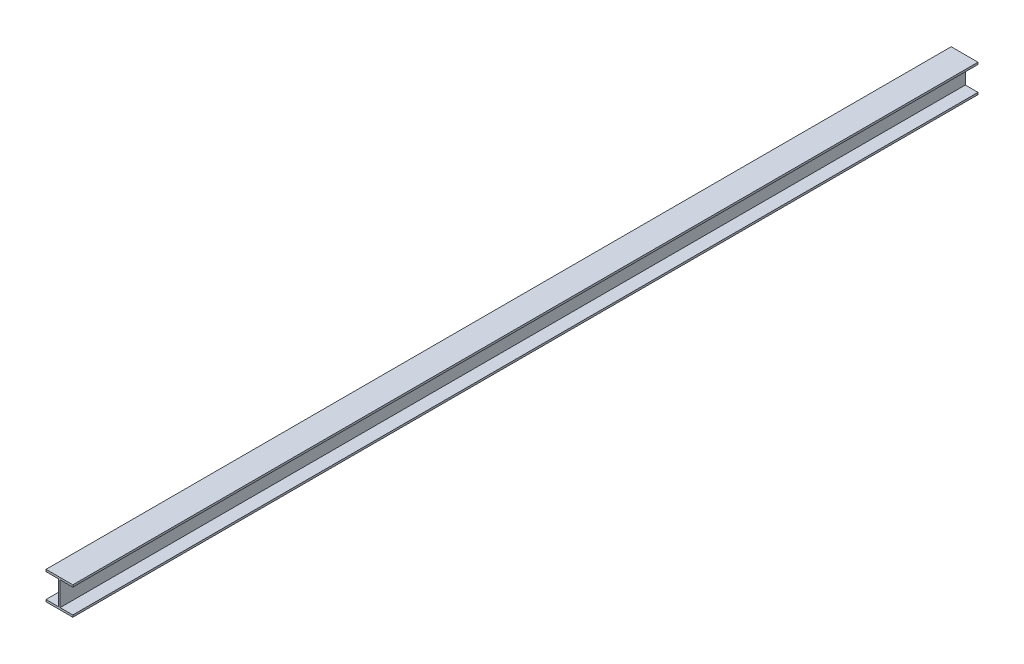
ISO-10303-21;
HEADER;
FILE_DESCRIPTION(('STEP AP214'),'2;1');
FILE_NAME('part.step','',(''),(''),'','','');
FILE_SCHEMA(('AUTOMOTIVE_DESIGN { 1 0 10303 214 1 1 1 1 }'));
ENDSEC;
DATA;
#1=APPLICATION_CONTEXT('core data for automotive mechanical design processes');
#2=APPLICATION_PROTOCOL_DEFINITION('international standard','automotive_design',2000,#1);
#3=PRODUCT_CONTEXT('',#1,'mechanical');
#4=PRODUCT('Part','Part','',(#3));
#5=PRODUCT_RELATED_PRODUCT_CATEGORY('part','',(#4));
#6=PRODUCT_DEFINITION_FORMATION('','',#4);
#7=PRODUCT_DEFINITION_CONTEXT('part definition',#1,'design');
#8=PRODUCT_DEFINITION('design','',#6,#7);
#9=PRODUCT_DEFINITION_SHAPE('','',#8);
#10=(LENGTH_UNIT() NAMED_UNIT(*) SI_UNIT(.MILLI.,.METRE.));
#11=(NAMED_UNIT(*) PLANE_ANGLE_UNIT() SI_UNIT($,.RADIAN.));
#12=(NAMED_UNIT(*) SI_UNIT($,.STERADIAN.) SOLID_ANGLE_UNIT());
#13=UNCERTAINTY_MEASURE_WITH_UNIT(LENGTH_MEASURE(1.E-05),#10,'distance_accuracy_value','');
#14=(GEOMETRIC_REPRESENTATION_CONTEXT(3) GLOBAL_UNCERTAINTY_ASSIGNED_CONTEXT((#13)) GLOBAL_UNIT_ASSIGNED_CONTEXT((#10,
#11,#12)) REPRESENTATION_CONTEXT('',''));
#15=CARTESIAN_POINT('',(0.,0.,0.));
#16=DIRECTION('',(0.,0.,1.));
#17=DIRECTION('',(1.,0.,0.));
#18=AXIS2_PLACEMENT_3D('',#15,#16,#17);
#19=CARTESIAN_POINT('',(154.432,-162.052240532958,5214.4));
#20=DIRECTION('',(0.,1.,0.));
#21=DIRECTION('',(-1.,0.,0.));
#22=AXIS2_PLACEMENT_3D('',#19,#20,#21);
#23=PLANE('',#22);
#24=DIRECTION('',(1.,0.,0.));
#25=VECTOR('',#24,1.);
#26=CARTESIAN_POINT('',(154.432,-162.052240532958,598.019975105255));
#27=LINE('',#26,#25);
#28=CARTESIAN_POINT('',(0.,-162.052240532958,598.019975105257));
#29=VERTEX_POINT('',#28);
#30=CARTESIAN_POINT('',(154.432,-162.052240532958,598.019975105257));
#31=VERTEX_POINT('',#30);
#32=EDGE_CURVE('E11',#29,#31,#27,.T.);
#33=ORIENTED_EDGE('',*,*,#32,.F.);
#34=DIRECTION('',(0.,0.,-1.));
#35=VECTOR('',#34,1.);
#36=CARTESIAN_POINT('',(0.,-162.052240532958,5214.4));
#37=LINE('',#36,#35);
#38=CARTESIAN_POINT('',(0.,-162.052240532958,0.));
#39=VERTEX_POINT('',#38);
#40=EDGE_CURVE('E222',#29,#39,#37,.T.);
#41=ORIENTED_EDGE('',*,*,#40,.T.);
#42=DIRECTION('',(1.,0.,0.));
#43=VECTOR('',#42,1.);
#44=CARTESIAN_POINT('',(154.432,-162.052240532958,0.));
#45=LINE('',#44,#43);
#46=CARTESIAN_POINT('',(154.432,-162.052240532958,0.));
#47=VERTEX_POINT('',#46);
#48=EDGE_CURVE('E292',#39,#47,#45,.T.);
#49=ORIENTED_EDGE('',*,*,#48,.T.);
#50=DIRECTION('',(0.,0.,-1.));
#51=VECTOR('',#50,1.);
#52=CARTESIAN_POINT('',(154.432,-162.052240532958,5214.4));
#53=LINE('',#52,#51);
#54=EDGE_CURVE('E255',#31,#47,#53,.T.);
#55=ORIENTED_EDGE('',*,*,#54,.F.);
#56=EDGE_LOOP('',(#33,#41,#49,#55));
#57=FACE_BOUND('',#56,.T.);
#58=ADVANCED_FACE('F37',(#57),#23,.F.);
#59=DIRECTION('',(-1.,0.,0.));
#60=VECTOR('',#59,1.);
#61=CARTESIAN_POINT('',(154.432,-162.052240532958,902.819975105255));
#62=LINE('',#61,#60);
#63=CARTESIAN_POINT('',(154.432,-162.052240532958,902.819975105257));
#64=VERTEX_POINT('',#63);
#65=CARTESIAN_POINT('',(0.,-162.052240532958,902.819975105257));
#66=VERTEX_POINT('',#65);
#67=EDGE_CURVE('E46',#64,#66,#62,.T.);
#68=ORIENTED_EDGE('',*,*,#67,.F.);
#69=CARTESIAN_POINT('',(154.432,-162.052240532958,2454.8));
#70=VERTEX_POINT('',#69);
#71=EDGE_CURVE('E252',#70,#64,#53,.T.);
#72=ORIENTED_EDGE('',*,*,#71,.F.);
#73=DIRECTION('',(1.,0.,0.));
#74=VECTOR('',#73,1.);
#75=CARTESIAN_POINT('',(154.432,-162.052240532958,2454.8));
#76=LINE('',#75,#74);
#77=CARTESIAN_POINT('',(0.,-162.052240532958,2454.8));
#78=VERTEX_POINT('',#77);
#79=EDGE_CURVE('E188',#78,#70,#76,.T.);
#80=ORIENTED_EDGE('',*,*,#79,.F.);
#81=EDGE_CURVE('E220',#78,#66,#37,.T.);
#82=ORIENTED_EDGE('',*,*,#81,.T.);
#83=EDGE_LOOP('',(#68,#72,#80,#82));
#84=FACE_BOUND('',#83,.T.);
#85=ADVANCED_FACE('F225',(#84),#23,.F.);
#86=DIRECTION('',(1.,0.,0.));
#87=VECTOR('',#86,1.);
#88=CARTESIAN_POINT('',(154.432,-162.052240532958,4311.58002489475));
#89=LINE('',#88,#87);
#90=CARTESIAN_POINT('',(0.,-162.052240532958,4311.58002489475));
#91=VERTEX_POINT('',#90);
#92=CARTESIAN_POINT('',(154.432,-162.052240532958,4311.58002489475));
#93=VERTEX_POINT('',#92);
#94=EDGE_CURVE('E203',#91,#93,#89,.T.);
#95=ORIENTED_EDGE('',*,*,#94,.F.);
#96=CARTESIAN_POINT('',(0.,-162.052240532958,2759.6));
#97=VERTEX_POINT('',#96);
#98=EDGE_CURVE('E224',#91,#97,#37,.T.);
#99=ORIENTED_EDGE('',*,*,#98,.T.);
#100=DIRECTION('',(-1.,0.,0.));
#101=VECTOR('',#100,1.);
#102=CARTESIAN_POINT('',(154.432,-162.052240532958,2759.6));
#103=LINE('',#102,#101);
#104=CARTESIAN_POINT('',(154.432,-162.052240532958,2759.6));
#105=VERTEX_POINT('',#104);
#106=EDGE_CURVE('E191',#105,#97,#103,.T.);
#107=ORIENTED_EDGE('',*,*,#106,.F.);
#108=EDGE_CURVE('E249',#93,#105,#53,.T.);
#109=ORIENTED_EDGE('',*,*,#108,.F.);
#110=EDGE_LOOP('',(#95,#99,#107,#109));
#111=FACE_BOUND('',#110,.T.);
#112=ADVANCED_FACE('F239',(#111),#23,.F.);
#113=DIRECTION('',(-1.,0.,0.));
#114=VECTOR('',#113,1.);
#115=CARTESIAN_POINT('',(154.432,-162.052240532958,4616.38002489475));
#116=LINE('',#115,#114);
#117=CARTESIAN_POINT('',(154.432,-162.052240532958,4616.38002489475));
#118=VERTEX_POINT('',#117);
#119=CARTESIAN_POINT('',(0.,-162.052240532958,4616.38002489475));
#120=VERTEX_POINT('',#119);
#121=EDGE_CURVE('E200',#118,#120,#116,.T.);
#122=ORIENTED_EDGE('',*,*,#121,.F.);
#123=CARTESIAN_POINT('',(154.432,-162.052240532958,5214.4));
#124=VERTEX_POINT('',#123);
#125=EDGE_CURVE('E250',#124,#118,#53,.T.);
#126=ORIENTED_EDGE('',*,*,#125,.F.);
#127=DIRECTION('',(1.,0.,0.));
#128=VECTOR('',#127,1.);
#129=CARTESIAN_POINT('',(154.432,-162.052240532958,5214.4));
#130=LINE('',#129,#128);
#131=CARTESIAN_POINT('',(0.,-162.052240532958,5214.4));
#132=VERTEX_POINT('',#131);
#133=EDGE_CURVE('E314',#132,#124,#130,.T.);
#134=ORIENTED_EDGE('',*,*,#133,.F.);
#135=EDGE_CURVE('E228',#132,#120,#37,.T.);
#136=ORIENTED_EDGE('',*,*,#135,.T.);
#137=EDGE_LOOP('',(#122,#126,#134,#136));
#138=FACE_BOUND('',#137,.T.);
#139=ADVANCED_FACE('F336',(#138),#23,.F.);
#140=EDGE_CURVE('E227',#120,#91,#37,.T.);
#141=ORIENTED_EDGE('',*,*,#140,.T.);
#142=ORIENTED_EDGE('',*,*,#94,.T.);
#143=EDGE_CURVE('E251',#118,#93,#53,.T.);
#144=ORIENTED_EDGE('',*,*,#143,.F.);
#145=ORIENTED_EDGE('',*,*,#121,.T.);
#146=EDGE_LOOP('',(#141,#142,#144,#145));
#147=FACE_BOUND('',#146,.T.);
#148=ADVANCED_FACE('F379',(#147),#23,.F.);
#149=EDGE_CURVE('E210',#66,#29,#37,.T.);
#150=ORIENTED_EDGE('',*,*,#149,.T.);
#151=ORIENTED_EDGE('',*,*,#32,.T.);
#152=EDGE_CURVE('E212',#64,#31,#53,.T.);
#153=ORIENTED_EDGE('',*,*,#152,.F.);
#154=ORIENTED_EDGE('',*,*,#67,.T.);
#155=EDGE_LOOP('',(#150,#151,#153,#154));
#156=FACE_BOUND('',#155,.T.);
#157=ADVANCED_FACE('F209',(#156),#23,.F.);
#158=CARTESIAN_POINT('',(0.,-11.5572405329582,5214.4));
#159=DIRECTION('',(1.,0.,0.));
#160=DIRECTION('',(0.,0.,-1.));
#161=AXIS2_PLACEMENT_3D('',#158,#159,#160);
#162=PLANE('',#161);
#163=DIRECTION('',(0.,-1.,0.));
#164=VECTOR('',#163,1.);
#165=CARTESIAN_POINT('',(0.,-11.5572405329582,0.));
#166=LINE('',#165,#164);
#167=CARTESIAN_POINT('',(0.,-0.000240532958150197,0.));
#168=VERTEX_POINT('',#167);
#169=CARTESIAN_POINT('',(0.,-11.5572405329582,0.));
#170=VERTEX_POINT('',#169);
#171=EDGE_CURVE('E187',#168,#170,#166,.T.);
#172=ORIENTED_EDGE('',*,*,#171,.T.);
#173=DIRECTION('',(0.,0.,-1.));
#174=VECTOR('',#173,1.);
#175=CARTESIAN_POINT('',(0.,-11.5572405329582,5214.4));
#176=LINE('',#175,#174);
#177=CARTESIAN_POINT('',(0.,-11.5572405329582,5214.4));
#178=VERTEX_POINT('',#177);
#179=EDGE_CURVE('E168',#178,#170,#176,.T.);
#180=ORIENTED_EDGE('',*,*,#179,.F.);
#181=DIRECTION('',(0.,-1.,0.));
#182=VECTOR('',#181,1.);
#183=CARTESIAN_POINT('',(0.,-11.5572405329582,5214.4));
#184=LINE('',#183,#182);
#185=CARTESIAN_POINT('',(0.,-0.000240532958150197,5214.4));
#186=VERTEX_POINT('',#185);
#187=EDGE_CURVE('E175',#186,#178,#184,.T.);
#188=ORIENTED_EDGE('',*,*,#187,.F.);
#189=DIRECTION('',(0.,0.,-1.));
#190=VECTOR('',#189,1.);
#191=CARTESIAN_POINT('',(0.,-0.000240532958150197,5214.4));
#192=LINE('',#191,#190);
#193=EDGE_CURVE('E279',#186,#168,#192,.T.);
#194=ORIENTED_EDGE('',*,*,#193,.T.);
#195=EDGE_LOOP('',(#172,#180,#188,#194));
#196=FACE_BOUND('',#195,.T.);
#197=ADVANCED_FACE('F39',(#196),#162,.F.);
#198=CARTESIAN_POINT('',(73.152,-11.5572405329581,5214.4));
#199=DIRECTION('',(0.,1.,0.));
#200=DIRECTION('',(-1.,0.,0.));
#201=AXIS2_PLACEMENT_3D('',#198,#199,#200);
#202=PLANE('',#201);
#203=DIRECTION('',(1.,0.,0.));
#204=VECTOR('',#203,1.);
#205=CARTESIAN_POINT('',(73.152,-11.5572405329581,0.));
#206=LINE('',#205,#204);
#207=CARTESIAN_POINT('',(73.152,-11.5572405329581,0.));
#208=VERTEX_POINT('',#207);
#209=EDGE_CURVE('E300',#170,#208,#206,.T.);
#210=ORIENTED_EDGE('',*,*,#209,.T.);
#211=DIRECTION('',(0.,0.,-1.));
#212=VECTOR('',#211,1.);
#213=CARTESIAN_POINT('',(73.152,-11.5572405329581,5214.4));
#214=LINE('',#213,#212);
#215=CARTESIAN_POINT('',(73.152,-11.5572405329581,5214.4));
#216=VERTEX_POINT('',#215);
#217=EDGE_CURVE('E171',#216,#208,#214,.T.);
#218=ORIENTED_EDGE('',*,*,#217,.F.);
#219=DIRECTION('',(1.,0.,0.));
#220=VECTOR('',#219,1.);
#221=CARTESIAN_POINT('',(73.152,-11.5572405329581,5214.4));
#222=LINE('',#221,#220);
#223=EDGE_CURVE('E164',#178,#216,#222,.T.);
#224=ORIENTED_EDGE('',*,*,#223,.F.);
#225=ORIENTED_EDGE('',*,*,#179,.T.);
#226=EDGE_LOOP('',(#210,#218,#224,#225));
#227=FACE_BOUND('',#226,.T.);
#228=ADVANCED_FACE('F166',(#227),#202,.F.);
#229=CARTESIAN_POINT('',(73.152,-150.495240532958,5214.4));
#230=DIRECTION('',(1.,0.,0.));
#231=DIRECTION('',(0.,0.,-1.));
#232=AXIS2_PLACEMENT_3D('',#229,#230,#231);
#233=PLANE('',#232);
#234=DIRECTION('',(0.,-1.,0.));
#235=VECTOR('',#234,1.);
#236=CARTESIAN_POINT('',(73.152,-150.495240532958,0.));
#237=LINE('',#236,#235);
#238=CARTESIAN_POINT('',(73.152,-150.495240532958,0.));
#239=VERTEX_POINT('',#238);
#240=EDGE_CURVE('E298',#208,#239,#237,.T.);
#241=ORIENTED_EDGE('',*,*,#240,.T.);
#242=DIRECTION('',(0.,0.,-1.));
#243=VECTOR('',#242,1.);
#244=CARTESIAN_POINT('',(73.152,-150.495240532958,5214.4));
#245=LINE('',#244,#243);
#246=CARTESIAN_POINT('',(73.152,-150.495240532958,5214.4));
#247=VERTEX_POINT('',#246);
#248=EDGE_CURVE('E193',#247,#239,#245,.T.);
#249=ORIENTED_EDGE('',*,*,#248,.F.);
#250=DIRECTION('',(0.,-1.,0.));
#251=VECTOR('',#250,1.);
#252=CARTESIAN_POINT('',(73.152,-150.495240532958,5214.4));
#253=LINE('',#252,#251);
#254=EDGE_CURVE('E174',#216,#247,#253,.T.);
#255=ORIENTED_EDGE('',*,*,#254,.F.);
#256=ORIENTED_EDGE('',*,*,#217,.T.);
#257=EDGE_LOOP('',(#241,#249,#255,#256));
#258=FACE_BOUND('',#257,.T.);
#259=ADVANCED_FACE('F325',(#258),#233,.F.);
#260=CARTESIAN_POINT('',(0.,-150.495240532958,5214.4));
#261=DIRECTION('',(0.,-1.,0.));
#262=DIRECTION('',(1.,0.,0.));
#263=AXIS2_PLACEMENT_3D('',#260,#261,#262);
#264=PLANE('',#263);
#265=DIRECTION('',(-1.,0.,0.));
#266=VECTOR('',#265,1.);
#267=CARTESIAN_POINT('',(0.,-150.495240532958,0.));
#268=LINE('',#267,#266);
#269=CARTESIAN_POINT('',(0.,-150.495240532958,0.));
#270=VERTEX_POINT('',#269);
#271=EDGE_CURVE('E296',#239,#270,#268,.T.);
#272=ORIENTED_EDGE('',*,*,#271,.T.);
#273=DIRECTION('',(0.,0.,-1.));
#274=VECTOR('',#273,1.);
#275=CARTESIAN_POINT('',(0.,-150.495240532958,5214.4));
#276=LINE('',#275,#274);
#277=CARTESIAN_POINT('',(0.,-150.495240532958,5214.4));
#278=VERTEX_POINT('',#277);
#279=EDGE_CURVE('E235',#278,#270,#276,.T.);
#280=ORIENTED_EDGE('',*,*,#279,.F.);
#281=DIRECTION('',(-1.,0.,0.));
#282=VECTOR('',#281,1.);
#283=CARTESIAN_POINT('',(0.,-150.495240532958,5214.4));
#284=LINE('',#283,#282);
#285=EDGE_CURVE('E318',#247,#278,#284,.T.);
#286=ORIENTED_EDGE('',*,*,#285,.F.);
#287=ORIENTED_EDGE('',*,*,#248,.T.);
#288=EDGE_LOOP('',(#272,#280,#286,#287));
#289=FACE_BOUND('',#288,.T.);
#290=ADVANCED_FACE('F329',(#289),#264,.F.);
#291=CARTESIAN_POINT('',(0.,-162.052240532958,5214.4));
#292=DIRECTION('',(1.,0.,0.));
#293=DIRECTION('',(0.,1.,0.));
#294=AXIS2_PLACEMENT_3D('',#291,#292,#293);
#295=PLANE('',#294);
#296=DIRECTION('',(0.,-1.,0.));
#297=VECTOR('',#296,1.);
#298=CARTESIAN_POINT('',(0.,-162.052240532958,0.));
#299=LINE('',#298,#297);
#300=EDGE_CURVE('E294',#270,#39,#299,.T.);
#301=ORIENTED_EDGE('',*,*,#300,.T.);
#302=ORIENTED_EDGE('',*,*,#40,.F.);
#303=ORIENTED_EDGE('',*,*,#149,.F.);
#304=ORIENTED_EDGE('',*,*,#81,.F.);
#305=EDGE_CURVE('E226',#97,#78,#37,.T.);
#306=ORIENTED_EDGE('',*,*,#305,.F.);
#307=ORIENTED_EDGE('',*,*,#98,.F.);
#308=ORIENTED_EDGE('',*,*,#140,.F.);
#309=ORIENTED_EDGE('',*,*,#135,.F.);
#310=DIRECTION('',(0.,-1.,0.));
#311=VECTOR('',#310,1.);
#312=CARTESIAN_POINT('',(0.,-162.052240532958,5214.4));
#313=LINE('',#312,#311);
#314=EDGE_CURVE('E316',#278,#132,#313,.T.);
#315=ORIENTED_EDGE('',*,*,#314,.F.);
#316=ORIENTED_EDGE('',*,*,#279,.T.);
#317=EDGE_LOOP('',(#301,#302,#303,#304,#306,#307,#308,#309,#315,#316));
#318=FACE_BOUND('',#317,.T.);
#319=ADVANCED_FACE('F218',(#318),#295,.F.);
#320=CARTESIAN_POINT('',(154.432,-162.052240532958,2607.2));
#321=VERTEX_POINT('',#320);
#322=EDGE_CURVE('E245',#105,#321,#53,.T.);
#323=ORIENTED_EDGE('',*,*,#322,.F.);
#324=ORIENTED_EDGE('',*,*,#106,.T.);
#325=ORIENTED_EDGE('',*,*,#305,.T.);
#326=ORIENTED_EDGE('',*,*,#79,.T.);
#327=EDGE_CURVE('E247',#321,#70,#53,.T.);
#328=ORIENTED_EDGE('',*,*,#327,.F.);
#329=EDGE_LOOP('',(#323,#324,#325,#326,#328));
#330=FACE_BOUND('',#329,.T.);
#331=ADVANCED_FACE('F243',(#330),#23,.F.);
#332=CARTESIAN_POINT('',(154.432,-150.495240532958,5214.4));
#333=DIRECTION('',(-1.,0.,0.));
#334=DIRECTION('',(0.,0.,1.));
#335=AXIS2_PLACEMENT_3D('',#332,#333,#334);
#336=PLANE('',#335);
#337=DIRECTION('',(0.,1.,0.));
#338=VECTOR('',#337,1.);
#339=CARTESIAN_POINT('',(154.432,-150.495240532958,0.));
#340=LINE('',#339,#338);
#341=CARTESIAN_POINT('',(154.432,-150.495240532958,0.));
#342=VERTEX_POINT('',#341);
#343=EDGE_CURVE('E290',#47,#342,#340,.T.);
#344=ORIENTED_EDGE('',*,*,#343,.T.);
#345=DIRECTION('',(0.,0.,-1.));
#346=VECTOR('',#345,1.);
#347=CARTESIAN_POINT('',(154.432,-150.495240532958,5214.4));
#348=LINE('',#347,#346);
#349=CARTESIAN_POINT('',(154.432,-150.495240532958,5214.4));
#350=VERTEX_POINT('',#349);
#351=EDGE_CURVE('E259',#350,#342,#348,.T.);
#352=ORIENTED_EDGE('',*,*,#351,.F.);
#353=DIRECTION('',(0.,1.,0.));
#354=VECTOR('',#353,1.);
#355=CARTESIAN_POINT('',(154.432,-150.495240532958,5214.4));
#356=LINE('',#355,#354);
#357=EDGE_CURVE('E312',#124,#350,#356,.T.);
#358=ORIENTED_EDGE('',*,*,#357,.F.);
#359=ORIENTED_EDGE('',*,*,#125,.T.);
#360=ORIENTED_EDGE('',*,*,#143,.T.);
#361=ORIENTED_EDGE('',*,*,#108,.T.);
#362=ORIENTED_EDGE('',*,*,#322,.T.);
#363=ORIENTED_EDGE('',*,*,#327,.T.);
#364=ORIENTED_EDGE('',*,*,#71,.T.);
#365=ORIENTED_EDGE('',*,*,#152,.T.);
#366=ORIENTED_EDGE('',*,*,#54,.T.);
#367=EDGE_LOOP('',(#344,#352,#358,#359,#360,#361,#362,#363,#364,#365,#366));
#368=FACE_BOUND('',#367,.T.);
#369=ADVANCED_FACE('F338',(#368),#336,.F.);
#370=CARTESIAN_POINT('',(81.28,-150.495240532958,5214.4));
#371=DIRECTION('',(0.,-1.,0.));
#372=DIRECTION('',(1.,0.,0.));
#373=AXIS2_PLACEMENT_3D('',#370,#371,#372);
#374=PLANE('',#373);
#375=DIRECTION('',(-1.,0.,0.));
#376=VECTOR('',#375,1.);
#377=CARTESIAN_POINT('',(81.28,-150.495240532958,0.));
#378=LINE('',#377,#376);
#379=CARTESIAN_POINT('',(81.28,-150.495240532958,0.));
#380=VERTEX_POINT('',#379);
#381=EDGE_CURVE('E288',#342,#380,#378,.T.);
#382=ORIENTED_EDGE('',*,*,#381,.T.);
#383=DIRECTION('',(0.,0.,-1.));
#384=VECTOR('',#383,1.);
#385=CARTESIAN_POINT('',(81.28,-150.495240532958,5214.4));
#386=LINE('',#385,#384);
#387=CARTESIAN_POINT('',(81.28,-150.495240532958,5214.4));
#388=VERTEX_POINT('',#387);
#389=EDGE_CURVE('E262',#388,#380,#386,.T.);
#390=ORIENTED_EDGE('',*,*,#389,.F.);
#391=DIRECTION('',(-1.,0.,0.));
#392=VECTOR('',#391,1.);
#393=CARTESIAN_POINT('',(81.28,-150.495240532958,5214.4));
#394=LINE('',#393,#392);
#395=EDGE_CURVE('E310',#350,#388,#394,.T.);
#396=ORIENTED_EDGE('',*,*,#395,.F.);
#397=ORIENTED_EDGE('',*,*,#351,.T.);
#398=EDGE_LOOP('',(#382,#390,#396,#397));
#399=FACE_BOUND('',#398,.T.);
#400=ADVANCED_FACE('F341',(#399),#374,.F.);
#401=CARTESIAN_POINT('',(81.28,-11.5572405329582,5214.4));
#402=DIRECTION('',(-1.,0.,0.));
#403=DIRECTION('',(0.,-1.,0.));
#404=AXIS2_PLACEMENT_3D('',#401,#402,#403);
#405=PLANE('',#404);
#406=DIRECTION('',(0.,1.,0.));
#407=VECTOR('',#406,1.);
#408=CARTESIAN_POINT('',(81.28,-11.5572405329582,0.));
#409=LINE('',#408,#407);
#410=CARTESIAN_POINT('',(81.28,-11.5572405329582,0.));
#411=VERTEX_POINT('',#410);
#412=EDGE_CURVE('E286',#380,#411,#409,.T.);
#413=ORIENTED_EDGE('',*,*,#412,.T.);
#414=DIRECTION('',(0.,0.,-1.));
#415=VECTOR('',#414,1.);
#416=CARTESIAN_POINT('',(81.28,-11.5572405329582,5214.4));
#417=LINE('',#416,#415);
#418=CARTESIAN_POINT('',(81.28,-11.5572405329582,5214.4));
#419=VERTEX_POINT('',#418);
#420=EDGE_CURVE('E268',#419,#411,#417,.T.);
#421=ORIENTED_EDGE('',*,*,#420,.F.);
#422=DIRECTION('',(0.,1.,0.));
#423=VECTOR('',#422,1.);
#424=CARTESIAN_POINT('',(81.28,-11.5572405329582,5214.4));
#425=LINE('',#424,#423);
#426=EDGE_CURVE('E308',#388,#419,#425,.T.);
#427=ORIENTED_EDGE('',*,*,#426,.F.);
#428=ORIENTED_EDGE('',*,*,#389,.T.);
#429=EDGE_LOOP('',(#413,#421,#427,#428));
#430=FACE_BOUND('',#429,.T.);
#431=ADVANCED_FACE('F347',(#430),#405,.F.);
#432=CARTESIAN_POINT('',(154.432,-11.5572405329581,5214.4));
#433=DIRECTION('',(0.,1.,0.));
#434=DIRECTION('',(-1.,0.,0.));
#435=AXIS2_PLACEMENT_3D('',#432,#433,#434);
#436=PLANE('',#435);
#437=DIRECTION('',(1.,0.,0.));
#438=VECTOR('',#437,1.);
#439=CARTESIAN_POINT('',(154.432,-11.5572405329581,0.));
#440=LINE('',#439,#438);
#441=CARTESIAN_POINT('',(154.432,-11.5572405329581,0.));
#442=VERTEX_POINT('',#441);
#443=EDGE_CURVE('E284',#411,#442,#440,.T.);
#444=ORIENTED_EDGE('',*,*,#443,.T.);
#445=DIRECTION('',(0.,0.,-1.));
#446=VECTOR('',#445,1.);
#447=CARTESIAN_POINT('',(154.432,-11.5572405329581,5214.4));
#448=LINE('',#447,#446);
#449=CARTESIAN_POINT('',(154.432,-11.5572405329581,5214.4));
#450=VERTEX_POINT('',#449);
#451=EDGE_CURVE('E273',#450,#442,#448,.T.);
#452=ORIENTED_EDGE('',*,*,#451,.F.);
#453=DIRECTION('',(1.,0.,0.));
#454=VECTOR('',#453,1.);
#455=CARTESIAN_POINT('',(154.432,-11.5572405329581,5214.4));
#456=LINE('',#455,#454);
#457=EDGE_CURVE('E306',#419,#450,#456,.T.);
#458=ORIENTED_EDGE('',*,*,#457,.F.);
#459=ORIENTED_EDGE('',*,*,#420,.T.);
#460=EDGE_LOOP('',(#444,#452,#458,#459));
#461=FACE_BOUND('',#460,.T.);
#462=ADVANCED_FACE('F351',(#461),#436,.F.);
#463=CARTESIAN_POINT('',(154.432,-0.000240532958131285,5214.4));
#464=DIRECTION('',(-1.,0.,0.));
#465=DIRECTION('',(0.,0.,1.));
#466=AXIS2_PLACEMENT_3D('',#463,#464,#465);
#467=PLANE('',#466);
#468=DIRECTION('',(0.,1.,0.));
#469=VECTOR('',#468,1.);
#470=CARTESIAN_POINT('',(154.432,-0.000240532958131285,0.));
#471=LINE('',#470,#469);
#472=CARTESIAN_POINT('',(154.432,-0.000240532958131285,0.));
#473=VERTEX_POINT('',#472);
#474=EDGE_CURVE('E282',#442,#473,#471,.T.);
#475=ORIENTED_EDGE('',*,*,#474,.T.);
#476=DIRECTION('',(0.,0.,-1.));
#477=VECTOR('',#476,1.);
#478=CARTESIAN_POINT('',(154.432,-0.000240532958131285,5214.4));
#479=LINE('',#478,#477);
#480=CARTESIAN_POINT('',(154.432,-0.000240532958131285,5214.4));
#481=VERTEX_POINT('',#480);
#482=EDGE_CURVE('E276',#481,#473,#479,.T.);
#483=ORIENTED_EDGE('',*,*,#482,.F.);
#484=DIRECTION('',(0.,1.,0.));
#485=VECTOR('',#484,1.);
#486=CARTESIAN_POINT('',(154.432,-0.000240532958131285,5214.4));
#487=LINE('',#486,#485);
#488=EDGE_CURVE('E304',#450,#481,#487,.T.);
#489=ORIENTED_EDGE('',*,*,#488,.F.);
#490=ORIENTED_EDGE('',*,*,#451,.T.);
#491=EDGE_LOOP('',(#475,#483,#489,#490));
#492=FACE_BOUND('',#491,.T.);
#493=ADVANCED_FACE('F356',(#492),#467,.F.);
#494=CARTESIAN_POINT('',(0.,-0.000240532958150197,5214.4));
#495=DIRECTION('',(0.,-1.,0.));
#496=DIRECTION('',(1.,0.,0.));
#497=AXIS2_PLACEMENT_3D('',#494,#495,#496);
#498=PLANE('',#497);
#499=DIRECTION('',(-1.,0.,0.));
#500=VECTOR('',#499,1.);
#501=CARTESIAN_POINT('',(0.,-0.000240532958150197,0.));
#502=LINE('',#501,#500);
#503=EDGE_CURVE('E184',#473,#168,#502,.T.);
#504=ORIENTED_EDGE('',*,*,#503,.T.);
#505=ORIENTED_EDGE('',*,*,#193,.F.);
#506=DIRECTION('',(-1.,0.,0.));
#507=VECTOR('',#506,1.);
#508=CARTESIAN_POINT('',(0.,-0.000240532958150197,5214.4));
#509=LINE('',#508,#507);
#510=EDGE_CURVE('E180',#481,#186,#509,.T.);
#511=ORIENTED_EDGE('',*,*,#510,.F.);
#512=ORIENTED_EDGE('',*,*,#482,.T.);
#513=EDGE_LOOP('',(#504,#505,#511,#512));
#514=FACE_BOUND('',#513,.T.);
#515=ADVANCED_FACE('F359',(#514),#498,.F.);
#516=CARTESIAN_POINT('',(0.,0.,5214.4));
#517=DIRECTION('',(0.,0.,-1.));
#518=DIRECTION('',(-1.,0.,0.));
#519=AXIS2_PLACEMENT_3D('',#516,#517,#518);
#520=PLANE('',#519);
#521=ORIENTED_EDGE('',*,*,#187,.T.);
#522=ORIENTED_EDGE('',*,*,#223,.T.);
#523=ORIENTED_EDGE('',*,*,#254,.T.);
#524=ORIENTED_EDGE('',*,*,#285,.T.);
#525=ORIENTED_EDGE('',*,*,#314,.T.);
#526=ORIENTED_EDGE('',*,*,#133,.T.);
#527=ORIENTED_EDGE('',*,*,#357,.T.);
#528=ORIENTED_EDGE('',*,*,#395,.T.);
#529=ORIENTED_EDGE('',*,*,#426,.T.);
#530=ORIENTED_EDGE('',*,*,#457,.T.);
#531=ORIENTED_EDGE('',*,*,#488,.T.);
#532=ORIENTED_EDGE('',*,*,#510,.T.);
#533=EDGE_LOOP('',(#521,#522,#523,#524,#525,#526,#527,#528,#529,#530,#531,#532));
#534=FACE_BOUND('',#533,.T.);
#535=ADVANCED_FACE('F178',(#534),#520,.F.);
#536=CARTESIAN_POINT('',(0.,0.,0.));
#537=DIRECTION('',(0.,0.,-1.));
#538=DIRECTION('',(-1.,0.,0.));
#539=AXIS2_PLACEMENT_3D('',#536,#537,#538);
#540=PLANE('',#539);
#541=ORIENTED_EDGE('',*,*,#171,.F.);
#542=ORIENTED_EDGE('',*,*,#503,.F.);
#543=ORIENTED_EDGE('',*,*,#474,.F.);
#544=ORIENTED_EDGE('',*,*,#443,.F.);
#545=ORIENTED_EDGE('',*,*,#412,.F.);
#546=ORIENTED_EDGE('',*,*,#381,.F.);
#547=ORIENTED_EDGE('',*,*,#343,.F.);
#548=ORIENTED_EDGE('',*,*,#48,.F.);
#549=ORIENTED_EDGE('',*,*,#300,.F.);
#550=ORIENTED_EDGE('',*,*,#271,.F.);
#551=ORIENTED_EDGE('',*,*,#240,.F.);
#552=ORIENTED_EDGE('',*,*,#209,.F.);
#553=EDGE_LOOP('',(#541,#542,#543,#544,#545,#546,#547,#548,#549,#550,#551,#552));
#554=FACE_BOUND('',#553,.T.);
#555=ADVANCED_FACE('F361',(#554),#540,.T.);
#556=CLOSED_SHELL('',(#58,#85,#112,#139,#148,#157,#197,#228,#259,#290,#319,#331,#369,#400,#431,
#462,#493,#515,#535,#555));
#557=MANIFOLD_SOLID_BREP('B2',#556);
#558=ADVANCED_BREP_SHAPE_REPRESENTATION('',(#18,#557),#14);
#559=SHAPE_DEFINITION_REPRESENTATION(#9,#558);
ENDSEC;
END-ISO-10303-21;
